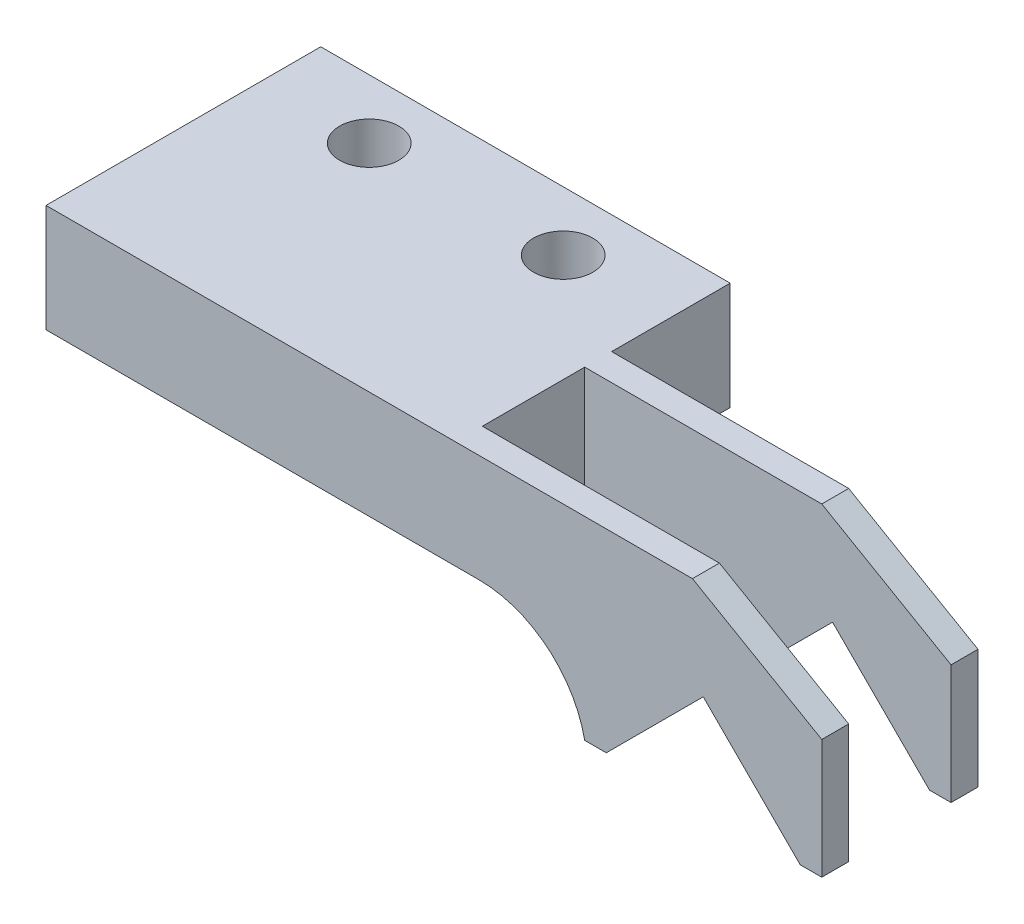
ISO-10303-21;
HEADER;
FILE_DESCRIPTION(('STEP AP214'),'2;1');
FILE_NAME('part.step','',(''),(''),'','','');
FILE_SCHEMA(('AUTOMOTIVE_DESIGN { 1 0 10303 214 1 1 1 1 }'));
ENDSEC;
DATA;
#1=APPLICATION_CONTEXT('core data for automotive mechanical design processes');
#2=APPLICATION_PROTOCOL_DEFINITION('international standard','automotive_design',2000,#1);
#3=PRODUCT_CONTEXT('',#1,'mechanical');
#4=PRODUCT('Part','Part','',(#3));
#5=PRODUCT_RELATED_PRODUCT_CATEGORY('part','',(#4));
#6=PRODUCT_DEFINITION_FORMATION('','',#4);
#7=PRODUCT_DEFINITION_CONTEXT('part definition',#1,'design');
#8=PRODUCT_DEFINITION('design','',#6,#7);
#9=PRODUCT_DEFINITION_SHAPE('','',#8);
#10=(LENGTH_UNIT() NAMED_UNIT(*) SI_UNIT(.MILLI.,.METRE.));
#11=(NAMED_UNIT(*) PLANE_ANGLE_UNIT() SI_UNIT($,.RADIAN.));
#12=(NAMED_UNIT(*) SI_UNIT($,.STERADIAN.) SOLID_ANGLE_UNIT());
#13=UNCERTAINTY_MEASURE_WITH_UNIT(LENGTH_MEASURE(1.E-05),#10,'distance_accuracy_value','');
#14=(GEOMETRIC_REPRESENTATION_CONTEXT(3) GLOBAL_UNCERTAINTY_ASSIGNED_CONTEXT((#13)) GLOBAL_UNIT_ASSIGNED_CONTEXT((#10,
#11,#12)) REPRESENTATION_CONTEXT('',''));
#15=CARTESIAN_POINT('',(0.,0.,0.));
#16=DIRECTION('',(0.,0.,1.));
#17=DIRECTION('',(1.,0.,0.));
#18=AXIS2_PLACEMENT_3D('',#15,#16,#17);
#19=CARTESIAN_POINT('',(40.2020410288673,-10.,25.5));
#20=DIRECTION('',(0.,0.,-1.));
#21=DIRECTION('',(-1.,0.,0.));
#22=AXIS2_PLACEMENT_3D('',#19,#20,#21);
#23=CYLINDRICAL_SURFACE('',#22,10.);
#24=DIRECTION('',(0.,0.,-1.));
#25=VECTOR('',#24,1.);
#26=CARTESIAN_POINT('',(50.,-8.,25.5));
#27=LINE('',#26,#25);
#28=CARTESIAN_POINT('',(50.,-8.,13.5));
#29=VERTEX_POINT('',#28);
#30=CARTESIAN_POINT('',(50.,-8.,11.));
#31=VERTEX_POINT('',#30);
#32=EDGE_CURVE('E322',#29,#31,#27,.T.);
#33=ORIENTED_EDGE('',*,*,#32,.F.);
#34=CARTESIAN_POINT('',(40.2020410288673,-10.,13.5));
#35=DIRECTION('',(0.,0.,1.));
#36=DIRECTION('',(1.,0.,0.));
#37=AXIS2_PLACEMENT_3D('',#34,#35,#36);
#38=CIRCLE('',#37,10.);
#39=CARTESIAN_POINT('',(40.2020410288673,0.,13.5));
#40=VERTEX_POINT('',#39);
#41=EDGE_CURVE('E233',#29,#40,#38,.T.);
#42=ORIENTED_EDGE('',*,*,#41,.T.);
#43=DIRECTION('',(0.,0.,-1.));
#44=VECTOR('',#43,1.);
#45=CARTESIAN_POINT('',(40.2020410288673,0.,25.5));
#46=LINE('',#45,#44);
#47=CARTESIAN_POINT('',(40.2020410288673,0.,11.));
#48=VERTEX_POINT('',#47);
#49=EDGE_CURVE('E318',#40,#48,#46,.T.);
#50=ORIENTED_EDGE('',*,*,#49,.T.);
#51=CARTESIAN_POINT('',(40.2020410288673,-10.,11.));
#52=DIRECTION('',(0.,0.,-1.));
#53=DIRECTION('',(-1.,0.,0.));
#54=AXIS2_PLACEMENT_3D('',#51,#52,#53);
#55=CIRCLE('',#54,10.);
#56=EDGE_CURVE('E271',#48,#31,#55,.T.);
#57=ORIENTED_EDGE('',*,*,#56,.T.);
#58=EDGE_LOOP('',(#33,#42,#50,#57));
#59=FACE_BOUND('',#58,.T.);
#60=ADVANCED_FACE('F32',(#59),#23,.F.);
#61=CARTESIAN_POINT('',(40.2020410288673,0.,25.5));
#62=VERTEX_POINT('',#61);
#63=CARTESIAN_POINT('',(40.2020410288673,0.,23.));
#64=VERTEX_POINT('',#63);
#65=EDGE_CURVE('E315',#62,#64,#46,.T.);
#66=ORIENTED_EDGE('',*,*,#65,.T.);
#67=CARTESIAN_POINT('',(40.2020410288673,-10.,23.));
#68=DIRECTION('',(0.,0.,-1.));
#69=DIRECTION('',(-1.,0.,0.));
#70=AXIS2_PLACEMENT_3D('',#67,#68,#69);
#71=CIRCLE('',#70,10.);
#72=CARTESIAN_POINT('',(50.,-8.,23.));
#73=VERTEX_POINT('',#72);
#74=EDGE_CURVE('E217',#64,#73,#71,.T.);
#75=ORIENTED_EDGE('',*,*,#74,.T.);
#76=CARTESIAN_POINT('',(50.,-8.,25.5));
#77=VERTEX_POINT('',#76);
#78=EDGE_CURVE('E319',#77,#73,#27,.T.);
#79=ORIENTED_EDGE('',*,*,#78,.F.);
#80=CARTESIAN_POINT('',(40.2020410288673,-10.,25.5));
#81=DIRECTION('',(0.,0.,1.));
#82=DIRECTION('',(1.,0.,0.));
#83=AXIS2_PLACEMENT_3D('',#80,#81,#82);
#84=CIRCLE('',#83,10.);
#85=EDGE_CURVE('E311',#77,#62,#84,.T.);
#86=ORIENTED_EDGE('',*,*,#85,.T.);
#87=EDGE_LOOP('',(#66,#75,#79,#86));
#88=FACE_BOUND('',#87,.T.);
#89=ADVANCED_FACE('F409',(#88),#23,.F.);
#90=CARTESIAN_POINT('',(52.,-8.,25.5));
#91=DIRECTION('',(0.,-1.,0.));
#92=DIRECTION('',(0.,0.,-1.));
#93=AXIS2_PLACEMENT_3D('',#90,#91,#92);
#94=PLANE('',#93);
#95=DIRECTION('',(0.,0.,-1.));
#96=VECTOR('',#95,1.);
#97=CARTESIAN_POINT('',(52.,-8.,25.5));
#98=LINE('',#97,#96);
#99=CARTESIAN_POINT('',(52.,-8.,13.5));
#100=VERTEX_POINT('',#99);
#101=CARTESIAN_POINT('',(52.,-8.,11.));
#102=VERTEX_POINT('',#101);
#103=EDGE_CURVE('E326',#100,#102,#98,.T.);
#104=ORIENTED_EDGE('',*,*,#103,.F.);
#105=DIRECTION('',(1.,0.,0.));
#106=VECTOR('',#105,1.);
#107=CARTESIAN_POINT('',(38.,-8.,13.5));
#108=LINE('',#107,#106);
#109=EDGE_CURVE('E212',#29,#100,#108,.T.);
#110=ORIENTED_EDGE('',*,*,#109,.F.);
#111=ORIENTED_EDGE('',*,*,#32,.T.);
#112=DIRECTION('',(-1.,0.,0.));
#113=VECTOR('',#112,1.);
#114=CARTESIAN_POINT('',(94.0023800911263,-8.,11.));
#115=LINE('',#114,#113);
#116=EDGE_CURVE('E252',#102,#31,#115,.T.);
#117=ORIENTED_EDGE('',*,*,#116,.F.);
#118=EDGE_LOOP('',(#104,#110,#111,#117));
#119=FACE_BOUND('',#118,.T.);
#120=ADVANCED_FACE('F374',(#119),#94,.T.);
#121=ORIENTED_EDGE('',*,*,#78,.T.);
#122=DIRECTION('',(-1.,0.,0.));
#123=VECTOR('',#122,1.);
#124=CARTESIAN_POINT('',(78.9350775744992,-8.,23.));
#125=LINE('',#124,#123);
#126=CARTESIAN_POINT('',(52.,-8.,23.));
#127=VERTEX_POINT('',#126);
#128=EDGE_CURVE('E198',#127,#73,#125,.T.);
#129=ORIENTED_EDGE('',*,*,#128,.F.);
#130=CARTESIAN_POINT('',(52.,-8.,25.5));
#131=VERTEX_POINT('',#130);
#132=EDGE_CURVE('E323',#131,#127,#98,.T.);
#133=ORIENTED_EDGE('',*,*,#132,.F.);
#134=DIRECTION('',(-1.,0.,0.));
#135=VECTOR('',#134,1.);
#136=CARTESIAN_POINT('',(52.,-8.,25.5));
#137=LINE('',#136,#135);
#138=EDGE_CURVE('E308',#131,#77,#137,.T.);
#139=ORIENTED_EDGE('',*,*,#138,.T.);
#140=EDGE_LOOP('',(#121,#129,#133,#139));
#141=FACE_BOUND('',#140,.T.);
#142=ADVANCED_FACE('F421',(#141),#94,.T.);
#143=CARTESIAN_POINT('',(52.,-8.,25.5));
#144=DIRECTION('',(-0.707106781186544,0.707106781186551,0.));
#145=DIRECTION('',(-0.707106781186551,-0.707106781186544,0.));
#146=AXIS2_PLACEMENT_3D('',#143,#144,#145);
#147=PLANE('',#146);
#148=DIRECTION('',(0.707106781186551,0.707106781186544,0.));
#149=VECTOR('',#148,1.);
#150=CARTESIAN_POINT('',(52.,-8.,13.5));
#151=LINE('',#150,#149);
#152=CARTESIAN_POINT('',(61.0000000000001,0.999999999999964,13.5));
#153=VERTEX_POINT('',#152);
#154=EDGE_CURVE('E243',#100,#153,#151,.T.);
#155=ORIENTED_EDGE('',*,*,#154,.F.);
#156=ORIENTED_EDGE('',*,*,#103,.T.);
#157=DIRECTION('',(-0.707106781186551,-0.707106781186544,0.));
#158=VECTOR('',#157,1.);
#159=CARTESIAN_POINT('',(52.,-8.,11.));
#160=LINE('',#159,#158);
#161=CARTESIAN_POINT('',(61.0000000000001,0.999999999999964,11.));
#162=VERTEX_POINT('',#161);
#163=EDGE_CURVE('E268',#162,#102,#160,.T.);
#164=ORIENTED_EDGE('',*,*,#163,.F.);
#165=DIRECTION('',(0.,0.,-1.));
#166=VECTOR('',#165,1.);
#167=CARTESIAN_POINT('',(61.0000000000001,0.999999999999964,25.5));
#168=LINE('',#167,#166);
#169=EDGE_CURVE('E330',#153,#162,#168,.T.);
#170=ORIENTED_EDGE('',*,*,#169,.F.);
#171=EDGE_LOOP('',(#155,#156,#164,#170));
#172=FACE_BOUND('',#171,.T.);
#173=ADVANCED_FACE('F378',(#172),#147,.F.);
#174=DIRECTION('',(-0.707106781186551,-0.707106781186544,0.));
#175=VECTOR('',#174,1.);
#176=CARTESIAN_POINT('',(52.,-8.,23.));
#177=LINE('',#176,#175);
#178=CARTESIAN_POINT('',(61.0000000000001,0.999999999999964,23.));
#179=VERTEX_POINT('',#178);
#180=EDGE_CURVE('E229',#179,#127,#177,.T.);
#181=ORIENTED_EDGE('',*,*,#180,.F.);
#182=CARTESIAN_POINT('',(61.0000000000001,0.999999999999964,25.5));
#183=VERTEX_POINT('',#182);
#184=EDGE_CURVE('E327',#183,#179,#168,.T.);
#185=ORIENTED_EDGE('',*,*,#184,.F.);
#186=DIRECTION('',(0.707106781186551,0.707106781186544,0.));
#187=VECTOR('',#186,1.);
#188=CARTESIAN_POINT('',(52.,-8.,25.5));
#189=LINE('',#188,#187);
#190=EDGE_CURVE('E306',#131,#183,#189,.T.);
#191=ORIENTED_EDGE('',*,*,#190,.F.);
#192=ORIENTED_EDGE('',*,*,#132,.T.);
#193=EDGE_LOOP('',(#181,#185,#191,#192));
#194=FACE_BOUND('',#193,.T.);
#195=ADVANCED_FACE('F424',(#194),#147,.F.);
#196=CARTESIAN_POINT('',(70.,-8.,25.5));
#197=DIRECTION('',(-0.707106781186549,-0.707106781186546,0.));
#198=DIRECTION('',(0.707106781186546,-0.707106781186549,0.));
#199=AXIS2_PLACEMENT_3D('',#196,#197,#198);
#200=PLANE('',#199);
#201=DIRECTION('',(0.,0.,-1.));
#202=VECTOR('',#201,1.);
#203=CARTESIAN_POINT('',(70.,-8.,25.5));
#204=LINE('',#203,#202);
#205=CARTESIAN_POINT('',(70.,-8.,13.5));
#206=VERTEX_POINT('',#205);
#207=CARTESIAN_POINT('',(70.,-8.,11.));
#208=VERTEX_POINT('',#207);
#209=EDGE_CURVE('E334',#206,#208,#204,.T.);
#210=ORIENTED_EDGE('',*,*,#209,.F.);
#211=DIRECTION('',(-0.707106781186546,0.707106781186549,0.));
#212=VECTOR('',#211,1.);
#213=CARTESIAN_POINT('',(70.,-8.,13.5));
#214=LINE('',#213,#212);
#215=EDGE_CURVE('E240',#206,#153,#214,.T.);
#216=ORIENTED_EDGE('',*,*,#215,.T.);
#217=ORIENTED_EDGE('',*,*,#169,.T.);
#218=DIRECTION('',(0.707106781186546,-0.707106781186549,0.));
#219=VECTOR('',#218,1.);
#220=CARTESIAN_POINT('',(70.,-8.,11.));
#221=LINE('',#220,#219);
#222=EDGE_CURVE('E265',#162,#208,#221,.T.);
#223=ORIENTED_EDGE('',*,*,#222,.T.);
#224=EDGE_LOOP('',(#210,#216,#217,#223));
#225=FACE_BOUND('',#224,.T.);
#226=ADVANCED_FACE('F386',(#225),#200,.T.);
#227=ORIENTED_EDGE('',*,*,#184,.T.);
#228=DIRECTION('',(0.707106781186546,-0.707106781186549,0.));
#229=VECTOR('',#228,1.);
#230=CARTESIAN_POINT('',(70.,-8.,23.));
#231=LINE('',#230,#229);
#232=CARTESIAN_POINT('',(70.,-8.,23.));
#233=VERTEX_POINT('',#232);
#234=EDGE_CURVE('E226',#179,#233,#231,.T.);
#235=ORIENTED_EDGE('',*,*,#234,.T.);
#236=CARTESIAN_POINT('',(70.,-8.,25.5));
#237=VERTEX_POINT('',#236);
#238=EDGE_CURVE('E331',#237,#233,#204,.T.);
#239=ORIENTED_EDGE('',*,*,#238,.F.);
#240=DIRECTION('',(-0.707106781186545,0.707106781186549,0.));
#241=VECTOR('',#240,1.);
#242=CARTESIAN_POINT('',(70.,-8.,25.5));
#243=LINE('',#242,#241);
#244=EDGE_CURVE('E303',#237,#183,#243,.T.);
#245=ORIENTED_EDGE('',*,*,#244,.T.);
#246=EDGE_LOOP('',(#227,#235,#239,#245));
#247=FACE_BOUND('',#246,.T.);
#248=ADVANCED_FACE('F427',(#247),#200,.T.);
#249=CARTESIAN_POINT('',(72.,-8.,25.5));
#250=DIRECTION('',(0.,-1.,0.));
#251=DIRECTION('',(0.,0.,-1.));
#252=AXIS2_PLACEMENT_3D('',#249,#250,#251);
#253=PLANE('',#252);
#254=DIRECTION('',(0.,0.,-1.));
#255=VECTOR('',#254,1.);
#256=CARTESIAN_POINT('',(72.,-8.,25.5));
#257=LINE('',#256,#255);
#258=CARTESIAN_POINT('',(72.,-8.,13.5));
#259=VERTEX_POINT('',#258);
#260=CARTESIAN_POINT('',(72.,-8.,11.));
#261=VERTEX_POINT('',#260);
#262=EDGE_CURVE('E338',#259,#261,#257,.T.);
#263=ORIENTED_EDGE('',*,*,#262,.F.);
#264=EDGE_CURVE('E211',#206,#259,#108,.T.);
#265=ORIENTED_EDGE('',*,*,#264,.F.);
#266=ORIENTED_EDGE('',*,*,#209,.T.);
#267=EDGE_CURVE('E255',#261,#208,#115,.T.);
#268=ORIENTED_EDGE('',*,*,#267,.F.);
#269=EDGE_LOOP('',(#263,#265,#266,#268));
#270=FACE_BOUND('',#269,.T.);
#271=ADVANCED_FACE('F390',(#270),#253,.T.);
#272=ORIENTED_EDGE('',*,*,#238,.T.);
#273=CARTESIAN_POINT('',(72.,-8.,23.));
#274=VERTEX_POINT('',#273);
#275=EDGE_CURVE('E210',#274,#233,#125,.T.);
#276=ORIENTED_EDGE('',*,*,#275,.F.);
#277=CARTESIAN_POINT('',(72.,-8.,25.5));
#278=VERTEX_POINT('',#277);
#279=EDGE_CURVE('E335',#278,#274,#257,.T.);
#280=ORIENTED_EDGE('',*,*,#279,.F.);
#281=DIRECTION('',(-1.,0.,0.));
#282=VECTOR('',#281,1.);
#283=CARTESIAN_POINT('',(72.,-8.,25.5));
#284=LINE('',#283,#282);
#285=EDGE_CURVE('E300',#278,#237,#284,.T.);
#286=ORIENTED_EDGE('',*,*,#285,.T.);
#287=EDGE_LOOP('',(#272,#276,#280,#286));
#288=FACE_BOUND('',#287,.T.);
#289=ADVANCED_FACE('F429',(#288),#253,.T.);
#290=CARTESIAN_POINT('',(72.,3.07179676972449,25.5));
#291=DIRECTION('',(1.,0.,0.));
#292=DIRECTION('',(0.,1.,0.));
#293=AXIS2_PLACEMENT_3D('',#290,#291,#292);
#294=PLANE('',#293);
#295=DIRECTION('',(0.,0.,-1.));
#296=VECTOR('',#295,1.);
#297=CARTESIAN_POINT('',(72.,3.07179676972449,25.5));
#298=LINE('',#297,#296);
#299=CARTESIAN_POINT('',(72.,3.07179676972449,13.5));
#300=VERTEX_POINT('',#299);
#301=CARTESIAN_POINT('',(72.,3.07179676972449,11.));
#302=VERTEX_POINT('',#301);
#303=EDGE_CURVE('E342',#300,#302,#298,.T.);
#304=ORIENTED_EDGE('',*,*,#303,.F.);
#305=DIRECTION('',(0.,-1.,0.));
#306=VECTOR('',#305,1.);
#307=CARTESIAN_POINT('',(72.,3.07179676972449,13.5));
#308=LINE('',#307,#306);
#309=EDGE_CURVE('E237',#300,#259,#308,.T.);
#310=ORIENTED_EDGE('',*,*,#309,.T.);
#311=ORIENTED_EDGE('',*,*,#262,.T.);
#312=DIRECTION('',(0.,1.,0.));
#313=VECTOR('',#312,1.);
#314=CARTESIAN_POINT('',(72.,3.07179676972449,11.));
#315=LINE('',#314,#313);
#316=EDGE_CURVE('E262',#261,#302,#315,.T.);
#317=ORIENTED_EDGE('',*,*,#316,.T.);
#318=EDGE_LOOP('',(#304,#310,#311,#317));
#319=FACE_BOUND('',#318,.T.);
#320=ADVANCED_FACE('F393',(#319),#294,.T.);
#321=ORIENTED_EDGE('',*,*,#279,.T.);
#322=DIRECTION('',(0.,1.,0.));
#323=VECTOR('',#322,1.);
#324=CARTESIAN_POINT('',(72.,3.07179676972449,23.));
#325=LINE('',#324,#323);
#326=CARTESIAN_POINT('',(72.,3.07179676972449,23.));
#327=VERTEX_POINT('',#326);
#328=EDGE_CURVE('E223',#274,#327,#325,.T.);
#329=ORIENTED_EDGE('',*,*,#328,.T.);
#330=CARTESIAN_POINT('',(72.,3.07179676972449,25.5));
#331=VERTEX_POINT('',#330);
#332=EDGE_CURVE('E339',#331,#327,#298,.T.);
#333=ORIENTED_EDGE('',*,*,#332,.F.);
#334=DIRECTION('',(0.,-1.,0.));
#335=VECTOR('',#334,1.);
#336=CARTESIAN_POINT('',(72.,3.07179676972449,25.5));
#337=LINE('',#336,#335);
#338=EDGE_CURVE('E297',#331,#278,#337,.T.);
#339=ORIENTED_EDGE('',*,*,#338,.T.);
#340=EDGE_LOOP('',(#321,#329,#333,#339));
#341=FACE_BOUND('',#340,.T.);
#342=ADVANCED_FACE('F398',(#341),#294,.T.);
#343=CARTESIAN_POINT('',(60.,10.,25.5));
#344=DIRECTION('',(0.500000000000001,0.866025403784438,0.));
#345=DIRECTION('',(-0.866025403784438,0.500000000000001,0.));
#346=AXIS2_PLACEMENT_3D('',#343,#344,#345);
#347=PLANE('',#346);
#348=DIRECTION('',(0.,0.,-1.));
#349=VECTOR('',#348,1.);
#350=CARTESIAN_POINT('',(60.,10.,25.5));
#351=LINE('',#350,#349);
#352=CARTESIAN_POINT('',(60.,10.,13.5));
#353=VERTEX_POINT('',#352);
#354=CARTESIAN_POINT('',(60.,10.,11.));
#355=VERTEX_POINT('',#354);
#356=EDGE_CURVE('E345',#353,#355,#351,.T.);
#357=ORIENTED_EDGE('',*,*,#356,.F.);
#358=DIRECTION('',(0.866025403784438,-0.500000000000001,0.));
#359=VECTOR('',#358,1.);
#360=CARTESIAN_POINT('',(60.,10.,13.5));
#361=LINE('',#360,#359);
#362=EDGE_CURVE('E195',#353,#300,#361,.T.);
#363=ORIENTED_EDGE('',*,*,#362,.T.);
#364=ORIENTED_EDGE('',*,*,#303,.T.);
#365=DIRECTION('',(-0.866025403784438,0.500000000000001,0.));
#366=VECTOR('',#365,1.);
#367=CARTESIAN_POINT('',(60.,10.,11.));
#368=LINE('',#367,#366);
#369=EDGE_CURVE('E259',#302,#355,#368,.T.);
#370=ORIENTED_EDGE('',*,*,#369,.T.);
#371=EDGE_LOOP('',(#357,#363,#364,#370));
#372=FACE_BOUND('',#371,.T.);
#373=ADVANCED_FACE('F395',(#372),#347,.T.);
#374=ORIENTED_EDGE('',*,*,#332,.T.);
#375=DIRECTION('',(-0.866025403784438,0.500000000000001,0.));
#376=VECTOR('',#375,1.);
#377=CARTESIAN_POINT('',(60.,10.,23.));
#378=LINE('',#377,#376);
#379=CARTESIAN_POINT('',(60.,10.,23.));
#380=VERTEX_POINT('',#379);
#381=EDGE_CURVE('E220',#327,#380,#378,.T.);
#382=ORIENTED_EDGE('',*,*,#381,.T.);
#383=CARTESIAN_POINT('',(60.,10.,25.5));
#384=VERTEX_POINT('',#383);
#385=EDGE_CURVE('E343',#384,#380,#351,.T.);
#386=ORIENTED_EDGE('',*,*,#385,.F.);
#387=DIRECTION('',(0.866025403784438,-0.500000000000001,0.));
#388=VECTOR('',#387,1.);
#389=CARTESIAN_POINT('',(60.,10.,25.5));
#390=LINE('',#389,#388);
#391=EDGE_CURVE('E294',#384,#331,#390,.T.);
#392=ORIENTED_EDGE('',*,*,#391,.T.);
#393=EDGE_LOOP('',(#374,#382,#386,#392));
#394=FACE_BOUND('',#393,.T.);
#395=ADVANCED_FACE('F397',(#394),#347,.T.);
#396=CARTESIAN_POINT('',(40.2020410288673,0.,25.5));
#397=DIRECTION('',(0.,-1.,0.));
#398=DIRECTION('',(0.,0.,-1.));
#399=AXIS2_PLACEMENT_3D('',#396,#397,#398);
#400=PLANE('',#399);
#401=CARTESIAN_POINT('',(28.,0.,5.5));
#402=DIRECTION('',(0.,-1.,0.));
#403=DIRECTION('',(0.,0.,-1.));
#404=AXIS2_PLACEMENT_3D('',#401,#402,#403);
#405=CIRCLE('',#404,5.);
#406=CARTESIAN_POINT('',(28.,0.,0.5));
#407=VERTEX_POINT('',#406);
#408=EDGE_CURVE('E663',#407,#407,#405,.T.);
#409=ORIENTED_EDGE('',*,*,#408,.F.);
#410=EDGE_LOOP('',(#409));
#411=FACE_BOUND('',#410,.T.);
#412=CARTESIAN_POINT('',(10.,0.,5.5));
#413=DIRECTION('',(0.,-1.,0.));
#414=DIRECTION('',(0.,0.,-1.));
#415=AXIS2_PLACEMENT_3D('',#412,#413,#414);
#416=CIRCLE('',#415,5.);
#417=CARTESIAN_POINT('',(10.,0.,0.5));
#418=VERTEX_POINT('',#417);
#419=EDGE_CURVE('E205',#418,#418,#416,.T.);
#420=ORIENTED_EDGE('',*,*,#419,.F.);
#421=EDGE_LOOP('',(#420));
#422=FACE_BOUND('',#421,.T.);
#423=ORIENTED_EDGE('',*,*,#49,.F.);
#424=DIRECTION('',(-1.,0.,0.));
#425=VECTOR('',#424,1.);
#426=CARTESIAN_POINT('',(40.2020410288673,0.,13.5));
#427=LINE('',#426,#425);
#428=CARTESIAN_POINT('',(38.,0.,13.5));
#429=VERTEX_POINT('',#428);
#430=EDGE_CURVE('E231',#40,#429,#427,.T.);
#431=ORIENTED_EDGE('',*,*,#430,.T.);
#432=DIRECTION('',(0.,0.,-1.));
#433=VECTOR('',#432,1.);
#434=CARTESIAN_POINT('',(38.,0.,25.5));
#435=LINE('',#434,#433);
#436=CARTESIAN_POINT('',(38.,0.,23.));
#437=VERTEX_POINT('',#436);
#438=EDGE_CURVE('E185',#437,#429,#435,.T.);
#439=ORIENTED_EDGE('',*,*,#438,.F.);
#440=DIRECTION('',(1.,0.,0.));
#441=VECTOR('',#440,1.);
#442=CARTESIAN_POINT('',(40.2020410288673,0.,23.));
#443=LINE('',#442,#441);
#444=EDGE_CURVE('E188',#437,#64,#443,.T.);
#445=ORIENTED_EDGE('',*,*,#444,.T.);
#446=ORIENTED_EDGE('',*,*,#65,.F.);
#447=DIRECTION('',(-1.,0.,0.));
#448=VECTOR('',#447,1.);
#449=CARTESIAN_POINT('',(40.2020410288673,0.,25.5));
#450=LINE('',#449,#448);
#451=CARTESIAN_POINT('',(0.,0.,25.5));
#452=VERTEX_POINT('',#451);
#453=EDGE_CURVE('E285',#62,#452,#450,.T.);
#454=ORIENTED_EDGE('',*,*,#453,.T.);
#455=DIRECTION('',(0.,0.,-1.));
#456=VECTOR('',#455,1.);
#457=CARTESIAN_POINT('',(0.,0.,25.5));
#458=LINE('',#457,#456);
#459=CARTESIAN_POINT('',(0.,0.,0.));
#460=VERTEX_POINT('',#459);
#461=EDGE_CURVE('E314',#452,#460,#458,.T.);
#462=ORIENTED_EDGE('',*,*,#461,.T.);
#463=DIRECTION('',(-1.,0.,0.));
#464=VECTOR('',#463,1.);
#465=CARTESIAN_POINT('',(40.2020410288673,0.,0.));
#466=LINE('',#465,#464);
#467=CARTESIAN_POINT('',(38.,0.,0.));
#468=VERTEX_POINT('',#467);
#469=EDGE_CURVE('E277',#468,#460,#466,.T.);
#470=ORIENTED_EDGE('',*,*,#469,.F.);
#471=DIRECTION('',(0.,0.,-1.));
#472=VECTOR('',#471,1.);
#473=CARTESIAN_POINT('',(38.,0.,25.5));
#474=LINE('',#473,#472);
#475=CARTESIAN_POINT('',(38.,0.,11.));
#476=VERTEX_POINT('',#475);
#477=EDGE_CURVE('E55',#476,#468,#474,.T.);
#478=ORIENTED_EDGE('',*,*,#477,.F.);
#479=DIRECTION('',(1.,0.,0.));
#480=VECTOR('',#479,1.);
#481=CARTESIAN_POINT('',(40.2020410288673,0.,11.));
#482=LINE('',#481,#480);
#483=EDGE_CURVE('E274',#476,#48,#482,.T.);
#484=ORIENTED_EDGE('',*,*,#483,.T.);
#485=EDGE_LOOP('',(#423,#431,#439,#445,#446,#454,#462,#470,#478,#484));
#486=FACE_BOUND('',#485,.T.);
#487=ADVANCED_FACE('F34',(#411,#422,#486),#400,.T.);
#488=CARTESIAN_POINT('',(0.,10.,25.5));
#489=DIRECTION('',(0.,1.,0.));
#490=DIRECTION('',(0.,0.,1.));
#491=AXIS2_PLACEMENT_3D('',#488,#489,#490);
#492=PLANE('',#491);
#493=CARTESIAN_POINT('',(10.,10.,5.5));
#494=DIRECTION('',(0.,1.,0.));
#495=DIRECTION('',(0.,0.,1.));
#496=AXIS2_PLACEMENT_3D('',#493,#494,#495);
#497=CIRCLE('',#496,2.75);
#498=CARTESIAN_POINT('',(10.,10.,8.25));
#499=VERTEX_POINT('',#498);
#500=EDGE_CURVE('E650',#499,#499,#497,.T.);
#501=ORIENTED_EDGE('',*,*,#500,.F.);
#502=EDGE_LOOP('',(#501));
#503=FACE_BOUND('',#502,.T.);
#504=CARTESIAN_POINT('',(28.,10.,5.5));
#505=DIRECTION('',(0.,1.,0.));
#506=DIRECTION('',(0.,0.,1.));
#507=AXIS2_PLACEMENT_3D('',#504,#505,#506);
#508=CIRCLE('',#507,2.75);
#509=CARTESIAN_POINT('',(28.,10.,8.25));
#510=VERTEX_POINT('',#509);
#511=EDGE_CURVE('E660',#510,#510,#508,.T.);
#512=ORIENTED_EDGE('',*,*,#511,.F.);
#513=EDGE_LOOP('',(#512));
#514=FACE_BOUND('',#513,.T.);
#515=DIRECTION('',(0.,0.,1.));
#516=VECTOR('',#515,1.);
#517=CARTESIAN_POINT('',(38.,10.,13.5));
#518=LINE('',#517,#516);
#519=CARTESIAN_POINT('',(38.,10.,13.5));
#520=VERTEX_POINT('',#519);
#521=CARTESIAN_POINT('',(38.,10.,23.));
#522=VERTEX_POINT('',#521);
#523=EDGE_CURVE('E47',#520,#522,#518,.T.);
#524=ORIENTED_EDGE('',*,*,#523,.F.);
#525=DIRECTION('',(1.,0.,0.));
#526=VECTOR('',#525,1.);
#527=CARTESIAN_POINT('',(38.,10.,13.5));
#528=LINE('',#527,#526);
#529=EDGE_CURVE('E192',#520,#353,#528,.T.);
#530=ORIENTED_EDGE('',*,*,#529,.T.);
#531=ORIENTED_EDGE('',*,*,#356,.T.);
#532=DIRECTION('',(-1.,0.,0.));
#533=VECTOR('',#532,1.);
#534=CARTESIAN_POINT('',(94.0023800911263,10.,11.));
#535=LINE('',#534,#533);
#536=CARTESIAN_POINT('',(38.,10.,11.));
#537=VERTEX_POINT('',#536);
#538=EDGE_CURVE('E249',#355,#537,#535,.T.);
#539=ORIENTED_EDGE('',*,*,#538,.T.);
#540=DIRECTION('',(0.,0.,1.));
#541=VECTOR('',#540,1.);
#542=CARTESIAN_POINT('',(38.,10.,-11.3645393323477));
#543=LINE('',#542,#541);
#544=CARTESIAN_POINT('',(38.,10.,0.));
#545=VERTEX_POINT('',#544);
#546=EDGE_CURVE('E246',#545,#537,#543,.T.);
#547=ORIENTED_EDGE('',*,*,#546,.F.);
#548=DIRECTION('',(1.,0.,0.));
#549=VECTOR('',#548,1.);
#550=CARTESIAN_POINT('',(0.,10.,0.));
#551=LINE('',#550,#549);
#552=CARTESIAN_POINT('',(0.,10.,0.));
#553=VERTEX_POINT('',#552);
#554=EDGE_CURVE('E282',#553,#545,#551,.T.);
#555=ORIENTED_EDGE('',*,*,#554,.F.);
#556=DIRECTION('',(0.,0.,-1.));
#557=VECTOR('',#556,1.);
#558=CARTESIAN_POINT('',(0.,10.,25.5));
#559=LINE('',#558,#557);
#560=CARTESIAN_POINT('',(0.,10.,25.5));
#561=VERTEX_POINT('',#560);
#562=EDGE_CURVE('E346',#561,#553,#559,.T.);
#563=ORIENTED_EDGE('',*,*,#562,.F.);
#564=DIRECTION('',(1.,0.,0.));
#565=VECTOR('',#564,1.);
#566=CARTESIAN_POINT('',(0.,10.,25.5));
#567=LINE('',#566,#565);
#568=EDGE_CURVE('E291',#561,#384,#567,.T.);
#569=ORIENTED_EDGE('',*,*,#568,.T.);
#570=ORIENTED_EDGE('',*,*,#385,.T.);
#571=DIRECTION('',(-1.,0.,0.));
#572=VECTOR('',#571,1.);
#573=CARTESIAN_POINT('',(0.,10.,23.));
#574=LINE('',#573,#572);
#575=EDGE_CURVE('E11',#380,#522,#574,.T.);
#576=ORIENTED_EDGE('',*,*,#575,.T.);
#577=EDGE_LOOP('',(#524,#530,#531,#539,#547,#555,#563,#569,#570,#576));
#578=FACE_BOUND('',#577,.T.);
#579=ADVANCED_FACE('F200',(#503,#514,#578),#492,.T.);
#580=CARTESIAN_POINT('',(0.,0.,25.5));
#581=DIRECTION('',(-1.,0.,0.));
#582=DIRECTION('',(0.,0.,1.));
#583=AXIS2_PLACEMENT_3D('',#580,#581,#582);
#584=PLANE('',#583);
#585=DIRECTION('',(0.,1.,0.));
#586=VECTOR('',#585,1.);
#587=CARTESIAN_POINT('',(0.,0.,0.));
#588=LINE('',#587,#586);
#589=EDGE_CURVE('E279',#460,#553,#588,.T.);
#590=ORIENTED_EDGE('',*,*,#589,.F.);
#591=ORIENTED_EDGE('',*,*,#461,.F.);
#592=DIRECTION('',(0.,1.,0.));
#593=VECTOR('',#592,1.);
#594=CARTESIAN_POINT('',(0.,0.,25.5));
#595=LINE('',#594,#593);
#596=EDGE_CURVE('E288',#452,#561,#595,.T.);
#597=ORIENTED_EDGE('',*,*,#596,.T.);
#598=ORIENTED_EDGE('',*,*,#562,.T.);
#599=EDGE_LOOP('',(#590,#591,#597,#598));
#600=FACE_BOUND('',#599,.T.);
#601=ADVANCED_FACE('F360',(#600),#584,.T.);
#602=CARTESIAN_POINT('',(40.2020410288673,-10.,25.5));
#603=DIRECTION('',(0.,0.,1.));
#604=DIRECTION('',(1.,0.,0.));
#605=AXIS2_PLACEMENT_3D('',#602,#603,#604);
#606=PLANE('',#605);
#607=ORIENTED_EDGE('',*,*,#453,.F.);
#608=ORIENTED_EDGE('',*,*,#85,.F.);
#609=ORIENTED_EDGE('',*,*,#138,.F.);
#610=ORIENTED_EDGE('',*,*,#190,.T.);
#611=ORIENTED_EDGE('',*,*,#244,.F.);
#612=ORIENTED_EDGE('',*,*,#285,.F.);
#613=ORIENTED_EDGE('',*,*,#338,.F.);
#614=ORIENTED_EDGE('',*,*,#391,.F.);
#615=ORIENTED_EDGE('',*,*,#568,.F.);
#616=ORIENTED_EDGE('',*,*,#596,.F.);
#617=EDGE_LOOP('',(#607,#608,#609,#610,#611,#612,#613,#614,#615,#616));
#618=FACE_BOUND('',#617,.T.);
#619=ADVANCED_FACE('F417',(#618),#606,.T.);
#620=CARTESIAN_POINT('',(40.2020410288673,-10.,0.));
#621=DIRECTION('',(0.,0.,1.));
#622=DIRECTION('',(1.,0.,0.));
#623=AXIS2_PLACEMENT_3D('',#620,#621,#622);
#624=PLANE('',#623);
#625=ORIENTED_EDGE('',*,*,#554,.T.);
#626=DIRECTION('',(0.,-1.,0.));
#627=VECTOR('',#626,1.);
#628=CARTESIAN_POINT('',(38.,-10.,0.));
#629=LINE('',#628,#627);
#630=EDGE_CURVE('E40',#545,#468,#629,.T.);
#631=ORIENTED_EDGE('',*,*,#630,.T.);
#632=ORIENTED_EDGE('',*,*,#469,.T.);
#633=ORIENTED_EDGE('',*,*,#589,.T.);
#634=EDGE_LOOP('',(#625,#631,#632,#633));
#635=FACE_BOUND('',#634,.T.);
#636=ADVANCED_FACE('F351',(#635),#624,.F.);
#637=CARTESIAN_POINT('',(94.0023800911263,-8.,11.));
#638=DIRECTION('',(0.,0.,-1.));
#639=DIRECTION('',(-1.,0.,0.));
#640=AXIS2_PLACEMENT_3D('',#637,#638,#639);
#641=PLANE('',#640);
#642=DIRECTION('',(0.,1.,0.));
#643=VECTOR('',#642,1.);
#644=CARTESIAN_POINT('',(38.,-8.,11.));
#645=LINE('',#644,#643);
#646=EDGE_CURVE('E256',#476,#537,#645,.T.);
#647=ORIENTED_EDGE('',*,*,#646,.T.);
#648=ORIENTED_EDGE('',*,*,#538,.F.);
#649=ORIENTED_EDGE('',*,*,#369,.F.);
#650=ORIENTED_EDGE('',*,*,#316,.F.);
#651=ORIENTED_EDGE('',*,*,#267,.T.);
#652=ORIENTED_EDGE('',*,*,#222,.F.);
#653=ORIENTED_EDGE('',*,*,#163,.T.);
#654=ORIENTED_EDGE('',*,*,#116,.T.);
#655=ORIENTED_EDGE('',*,*,#56,.F.);
#656=ORIENTED_EDGE('',*,*,#483,.F.);
#657=EDGE_LOOP('',(#647,#648,#649,#650,#651,#652,#653,#654,#655,#656));
#658=FACE_BOUND('',#657,.T.);
#659=ADVANCED_FACE('F365',(#658),#641,.T.);
#660=CARTESIAN_POINT('',(38.,-8.,-11.3645393323477));
#661=DIRECTION('',(-1.,0.,0.));
#662=DIRECTION('',(0.,0.,1.));
#663=AXIS2_PLACEMENT_3D('',#660,#661,#662);
#664=PLANE('',#663);
#665=ORIENTED_EDGE('',*,*,#477,.T.);
#666=ORIENTED_EDGE('',*,*,#630,.F.);
#667=ORIENTED_EDGE('',*,*,#546,.T.);
#668=ORIENTED_EDGE('',*,*,#646,.F.);
#669=EDGE_LOOP('',(#665,#666,#667,#668));
#670=FACE_BOUND('',#669,.T.);
#671=ADVANCED_FACE('F363',(#670),#664,.F.);
#672=CARTESIAN_POINT('',(38.,-8.,13.5));
#673=DIRECTION('',(0.,0.,1.));
#674=DIRECTION('',(1.,0.,0.));
#675=AXIS2_PLACEMENT_3D('',#672,#673,#674);
#676=PLANE('',#675);
#677=ORIENTED_EDGE('',*,*,#154,.T.);
#678=ORIENTED_EDGE('',*,*,#215,.F.);
#679=ORIENTED_EDGE('',*,*,#264,.T.);
#680=ORIENTED_EDGE('',*,*,#309,.F.);
#681=ORIENTED_EDGE('',*,*,#362,.F.);
#682=ORIENTED_EDGE('',*,*,#529,.F.);
#683=DIRECTION('',(0.,1.,0.));
#684=VECTOR('',#683,1.);
#685=CARTESIAN_POINT('',(38.,-8.,13.5));
#686=LINE('',#685,#684);
#687=EDGE_CURVE('E181',#429,#520,#686,.T.);
#688=ORIENTED_EDGE('',*,*,#687,.F.);
#689=ORIENTED_EDGE('',*,*,#430,.F.);
#690=ORIENTED_EDGE('',*,*,#41,.F.);
#691=ORIENTED_EDGE('',*,*,#109,.T.);
#692=EDGE_LOOP('',(#677,#678,#679,#680,#681,#682,#688,#689,#690,#691));
#693=FACE_BOUND('',#692,.T.);
#694=ADVANCED_FACE('F193',(#693),#676,.T.);
#695=CARTESIAN_POINT('',(78.9350775744992,-8.,23.));
#696=DIRECTION('',(0.,0.,-1.));
#697=DIRECTION('',(-1.,0.,0.));
#698=AXIS2_PLACEMENT_3D('',#695,#696,#697);
#699=PLANE('',#698);
#700=ORIENTED_EDGE('',*,*,#180,.T.);
#701=ORIENTED_EDGE('',*,*,#128,.T.);
#702=ORIENTED_EDGE('',*,*,#74,.F.);
#703=ORIENTED_EDGE('',*,*,#444,.F.);
#704=DIRECTION('',(0.,1.,0.));
#705=VECTOR('',#704,1.);
#706=CARTESIAN_POINT('',(38.,-8.,23.));
#707=LINE('',#706,#705);
#708=EDGE_CURVE('E189',#437,#522,#707,.T.);
#709=ORIENTED_EDGE('',*,*,#708,.T.);
#710=ORIENTED_EDGE('',*,*,#575,.F.);
#711=ORIENTED_EDGE('',*,*,#381,.F.);
#712=ORIENTED_EDGE('',*,*,#328,.F.);
#713=ORIENTED_EDGE('',*,*,#275,.T.);
#714=ORIENTED_EDGE('',*,*,#234,.F.);
#715=EDGE_LOOP('',(#700,#701,#702,#703,#709,#710,#711,#712,#713,#714));
#716=FACE_BOUND('',#715,.T.);
#717=ADVANCED_FACE('F451',(#716),#699,.T.);
#718=CARTESIAN_POINT('',(38.,-8.,13.5));
#719=DIRECTION('',(-1.,0.,0.));
#720=DIRECTION('',(0.,0.,1.));
#721=AXIS2_PLACEMENT_3D('',#718,#719,#720);
#722=PLANE('',#721);
#723=ORIENTED_EDGE('',*,*,#438,.T.);
#724=ORIENTED_EDGE('',*,*,#687,.T.);
#725=ORIENTED_EDGE('',*,*,#523,.T.);
#726=ORIENTED_EDGE('',*,*,#708,.F.);
#727=EDGE_LOOP('',(#723,#724,#725,#726));
#728=FACE_BOUND('',#727,.T.);
#729=ADVANCED_FACE('F183',(#728),#722,.F.);
#730=CARTESIAN_POINT('',(10.,6.,5.5));
#731=DIRECTION('',(0.,-1.,0.));
#732=DIRECTION('',(0.,0.,-1.));
#733=AXIS2_PLACEMENT_3D('',#730,#731,#732);
#734=CYLINDRICAL_SURFACE('',#733,5.);
#735=CARTESIAN_POINT('',(10.,6.,5.5));
#736=DIRECTION('',(0.,-1.,0.));
#737=DIRECTION('',(0.,0.,-1.));
#738=AXIS2_PLACEMENT_3D('',#735,#736,#737);
#739=CIRCLE('',#738,5.);
#740=CARTESIAN_POINT('',(10.,6.,0.5));
#741=VERTEX_POINT('',#740);
#742=EDGE_CURVE('E202',#741,#741,#739,.T.);
#743=ORIENTED_EDGE('',*,*,#742,.F.);
#744=EDGE_LOOP('',(#743));
#745=FACE_BOUND('',#744,.T.);
#746=ORIENTED_EDGE('',*,*,#419,.T.);
#747=EDGE_LOOP('',(#746));
#748=FACE_BOUND('',#747,.T.);
#749=ADVANCED_FACE('F584',(#745,#748),#734,.F.);
#750=CARTESIAN_POINT('',(10.,6.,5.5));
#751=DIRECTION('',(0.,-1.,0.));
#752=DIRECTION('',(0.,0.,-1.));
#753=AXIS2_PLACEMENT_3D('',#750,#751,#752);
#754=PLANE('',#753);
#755=CARTESIAN_POINT('',(10.,6.,5.5));
#756=DIRECTION('',(0.,-1.,0.));
#757=DIRECTION('',(0.,0.,-1.));
#758=AXIS2_PLACEMENT_3D('',#755,#756,#757);
#759=CIRCLE('',#758,2.75);
#760=CARTESIAN_POINT('',(10.,6.,2.75));
#761=VERTEX_POINT('',#760);
#762=EDGE_CURVE('E653',#761,#761,#759,.T.);
#763=ORIENTED_EDGE('',*,*,#762,.F.);
#764=EDGE_LOOP('',(#763));
#765=FACE_BOUND('',#764,.T.);
#766=ORIENTED_EDGE('',*,*,#742,.T.);
#767=EDGE_LOOP('',(#766));
#768=FACE_BOUND('',#767,.T.);
#769=ADVANCED_FACE('F593',(#765,#768),#754,.T.);
#770=CARTESIAN_POINT('',(28.,6.,5.5));
#771=DIRECTION('',(0.,-1.,0.));
#772=DIRECTION('',(0.,0.,-1.));
#773=AXIS2_PLACEMENT_3D('',#770,#771,#772);
#774=CYLINDRICAL_SURFACE('',#773,5.);
#775=CARTESIAN_POINT('',(28.,6.,5.5));
#776=DIRECTION('',(0.,-1.,0.));
#777=DIRECTION('',(0.,0.,-1.));
#778=AXIS2_PLACEMENT_3D('',#775,#776,#777);
#779=CIRCLE('',#778,5.);
#780=CARTESIAN_POINT('',(28.,6.,0.5));
#781=VERTEX_POINT('',#780);
#782=EDGE_CURVE('E666',#781,#781,#779,.T.);
#783=ORIENTED_EDGE('',*,*,#782,.F.);
#784=EDGE_LOOP('',(#783));
#785=FACE_BOUND('',#784,.T.);
#786=ORIENTED_EDGE('',*,*,#408,.T.);
#787=EDGE_LOOP('',(#786));
#788=FACE_BOUND('',#787,.T.);
#789=ADVANCED_FACE('F603',(#785,#788),#774,.F.);
#790=CARTESIAN_POINT('',(28.,6.,5.5));
#791=DIRECTION('',(0.,-1.,0.));
#792=DIRECTION('',(0.,0.,-1.));
#793=AXIS2_PLACEMENT_3D('',#790,#791,#792);
#794=PLANE('',#793);
#795=CARTESIAN_POINT('',(28.,6.,5.5));
#796=DIRECTION('',(0.,-1.,0.));
#797=DIRECTION('',(0.,0.,-1.));
#798=AXIS2_PLACEMENT_3D('',#795,#796,#797);
#799=CIRCLE('',#798,2.75);
#800=CARTESIAN_POINT('',(28.,6.,2.75));
#801=VERTEX_POINT('',#800);
#802=EDGE_CURVE('E655',#801,#801,#799,.T.);
#803=ORIENTED_EDGE('',*,*,#802,.F.);
#804=EDGE_LOOP('',(#803));
#805=FACE_BOUND('',#804,.T.);
#806=ORIENTED_EDGE('',*,*,#782,.T.);
#807=EDGE_LOOP('',(#806));
#808=FACE_BOUND('',#807,.T.);
#809=ADVANCED_FACE('F613',(#805,#808),#794,.T.);
#810=CARTESIAN_POINT('',(28.,12.,5.5));
#811=DIRECTION('',(0.,-1.,0.));
#812=DIRECTION('',(0.,0.,-1.));
#813=AXIS2_PLACEMENT_3D('',#810,#811,#812);
#814=CYLINDRICAL_SURFACE('',#813,2.75);
#815=ORIENTED_EDGE('',*,*,#511,.T.);
#816=EDGE_LOOP('',(#815));
#817=FACE_BOUND('',#816,.T.);
#818=ORIENTED_EDGE('',*,*,#802,.T.);
#819=EDGE_LOOP('',(#818));
#820=FACE_BOUND('',#819,.T.);
#821=ADVANCED_FACE('F623',(#817,#820),#814,.F.);
#822=CARTESIAN_POINT('',(10.,12.,5.5));
#823=DIRECTION('',(0.,-1.,0.));
#824=DIRECTION('',(0.,0.,-1.));
#825=AXIS2_PLACEMENT_3D('',#822,#823,#824);
#826=CYLINDRICAL_SURFACE('',#825,2.75);
#827=ORIENTED_EDGE('',*,*,#500,.T.);
#828=EDGE_LOOP('',(#827));
#829=FACE_BOUND('',#828,.T.);
#830=ORIENTED_EDGE('',*,*,#762,.T.);
#831=EDGE_LOOP('',(#830));
#832=FACE_BOUND('',#831,.T.);
#833=ADVANCED_FACE('F633',(#829,#832),#826,.F.);
#834=CLOSED_SHELL('',(#60,#89,#120,#142,#173,#195,#226,#248,#271,#289,#320,#342,#373,#395,#487,
#579,#601,#619,#636,#659,#671,#694,#717,#729,#749,#769,#789,#809,#821,#833));
#835=MANIFOLD_SOLID_BREP('B2',#834);
#836=ADVANCED_BREP_SHAPE_REPRESENTATION('',(#18,#835),#14);
#837=SHAPE_DEFINITION_REPRESENTATION(#9,#836);
ENDSEC;
END-ISO-10303-21;
